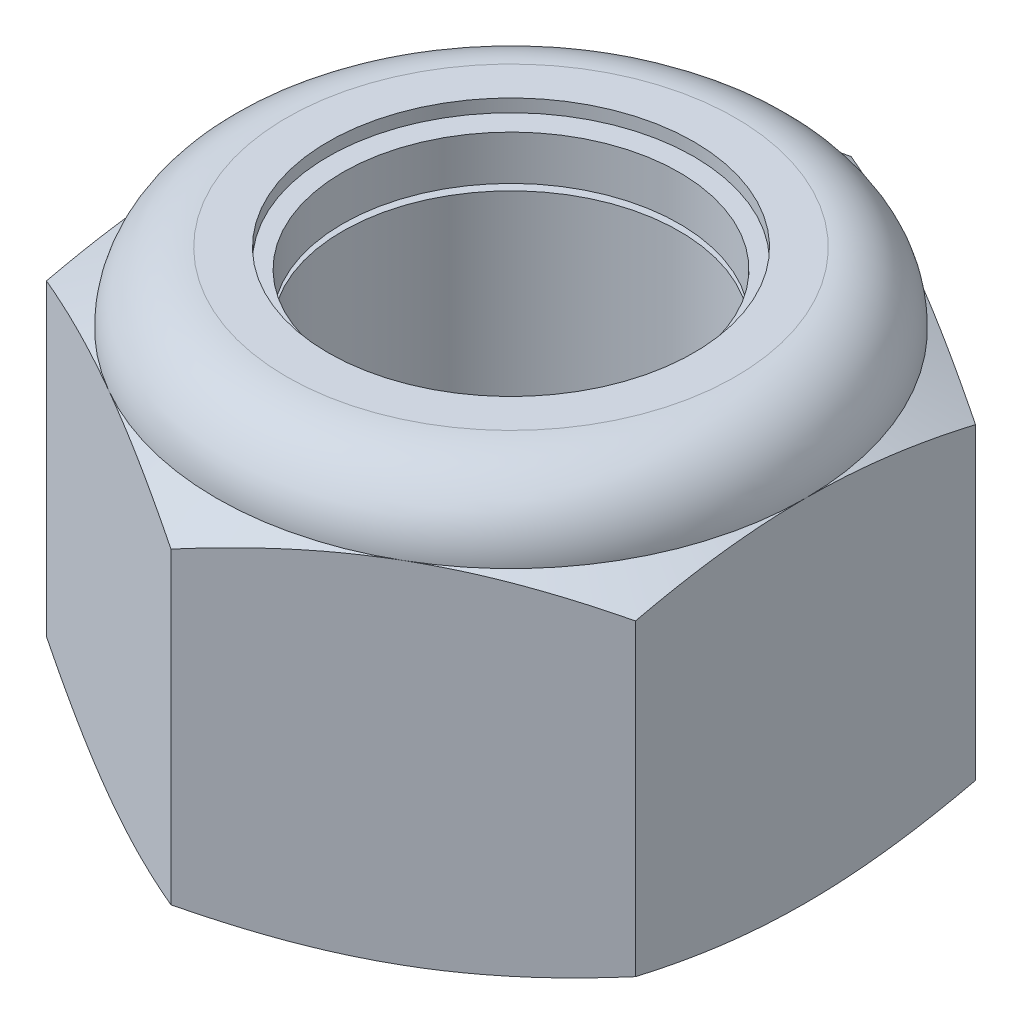
ISO-10303-21;
HEADER;
FILE_DESCRIPTION(('STEP AP214'),'2;1');
FILE_NAME('part.step','',(''),(''),'','','');
FILE_SCHEMA(('AUTOMOTIVE_DESIGN { 1 0 10303 214 1 1 1 1 }'));
ENDSEC;
DATA;
#1=APPLICATION_CONTEXT('core data for automotive mechanical design processes');
#2=APPLICATION_PROTOCOL_DEFINITION('international standard','automotive_design',2000,#1);
#3=PRODUCT_CONTEXT('',#1,'mechanical');
#4=PRODUCT('Part','Part','',(#3));
#5=PRODUCT_RELATED_PRODUCT_CATEGORY('part','',(#4));
#6=PRODUCT_DEFINITION_FORMATION('','',#4);
#7=PRODUCT_DEFINITION_CONTEXT('part definition',#1,'design');
#8=PRODUCT_DEFINITION('design','',#6,#7);
#9=PRODUCT_DEFINITION_SHAPE('','',#8);
#10=(LENGTH_UNIT() NAMED_UNIT(*) SI_UNIT(.MILLI.,.METRE.));
#11=(NAMED_UNIT(*) PLANE_ANGLE_UNIT() SI_UNIT($,.RADIAN.));
#12=(NAMED_UNIT(*) SI_UNIT($,.STERADIAN.) SOLID_ANGLE_UNIT());
#13=UNCERTAINTY_MEASURE_WITH_UNIT(LENGTH_MEASURE(1.E-05),#10,'distance_accuracy_value','');
#14=(GEOMETRIC_REPRESENTATION_CONTEXT(3) GLOBAL_UNCERTAINTY_ASSIGNED_CONTEXT((#13)) GLOBAL_UNIT_ASSIGNED_CONTEXT((#10,
#11,#12)) REPRESENTATION_CONTEXT('',''));
#15=CARTESIAN_POINT('',(0.,0.,0.));
#16=DIRECTION('',(0.,0.,1.));
#17=DIRECTION('',(1.,0.,0.));
#18=AXIS2_PLACEMENT_3D('',#15,#16,#17);
#19=CARTESIAN_POINT('',(0.,4.8476,-2.66666666666667));
#20=DIRECTION('',(0.,1.,0.));
#21=DIRECTION('',(0.,0.,-1.));
#22=AXIS2_PLACEMENT_3D('',#19,#20,#21);
#23=PLANE('',#22);
#24=CARTESIAN_POINT('',(0.,4.8476,0.));
#25=DIRECTION('',(0.,-1.,0.));
#26=DIRECTION('',(0.,0.,-1.));
#27=AXIS2_PLACEMENT_3D('',#24,#25,#26);
#28=CIRCLE('',#27,2.1731218886201);
#29=CARTESIAN_POINT('',(0.,4.8476,2.1731218886201));
#30=VERTEX_POINT('',#29);
#31=EDGE_CURVE('P0_E267',#30,#30,#28,.T.);
#32=ORIENTED_EDGE('',*,*,#31,.F.);
#33=EDGE_LOOP('',(#32));
#34=FACE_BOUND('',#33,.T.);
#35=CARTESIAN_POINT('',(0.,4.8476,0.));
#36=DIRECTION('',(0.,-1.,0.));
#37=DIRECTION('',(0.,0.,-1.));
#38=AXIS2_PLACEMENT_3D('',#35,#36,#37);
#39=CIRCLE('',#38,2.66666666666667);
#40=CARTESIAN_POINT('',(0.,4.8476,2.66666666666667));
#41=VERTEX_POINT('',#40);
#42=EDGE_CURVE('P0_E272',#41,#41,#39,.T.);
#43=ORIENTED_EDGE('',*,*,#42,.T.);
#44=EDGE_LOOP('',(#43));
#45=FACE_BOUND('',#44,.T.);
#46=ADVANCED_FACE('P0_F16',(#34,#45),#23,.F.);
#47=CARTESIAN_POINT('',(3.5,5.,-2.02072594216369));
#48=DIRECTION('',(-0.5,0.,0.866025403784439));
#49=DIRECTION('',(0.,1.,0.));
#50=AXIS2_PLACEMENT_3D('',#47,#48,#49);
#51=PLANE('',#50);
#52=DIRECTION('',(0.,-1.,0.));
#53=VECTOR('',#52,1.);
#54=CARTESIAN_POINT('',(0.,5.,-4.04145188432738));
#55=LINE('',#54,#53);
#56=CARTESIAN_POINT('',(0.,3.91418350648235,-4.04145188432738));
#57=VERTEX_POINT('',#56);
#58=CARTESIAN_POINT('',(0.,0.252483160184314,-4.04145188432738));
#59=VERTEX_POINT('',#58);
#60=EDGE_CURVE('P0_E11',#57,#59,#55,.T.);
#61=ORIENTED_EDGE('',*,*,#60,.F.);
#62=CARTESIAN_POINT('',(-1.59496526558943E-11,3.91418350647806,-4.04145188433659));
#63=CARTESIAN_POINT('',(0.93782217350252,4.16666666666667,-3.50000000000371));
#64=CARTESIAN_POINT('',(1.75,4.16666666666667,-3.03108891324554));
#65=(BOUNDED_CURVE() B_SPLINE_CURVE(2,(#62,#63,#64),.UNSPECIFIED.,.F.,
.F.) B_SPLINE_CURVE_WITH_KNOTS((3,3),(0.990996827703185,1.50671648657164),
.UNSPECIFIED.) CURVE() GEOMETRIC_REPRESENTATION_ITEM() RATIONAL_B_SPLINE_CURVE((2.39741003455638,
2.58285034609038,2.58285034609038)) REPRESENTATION_ITEM(''));
#66=CARTESIAN_POINT('',(1.75,4.16666666666667,-3.03108891324554));
#67=VERTEX_POINT('',#66);
#68=EDGE_CURVE('P0_E229',#57,#67,#65,.T.);
#69=ORIENTED_EDGE('',*,*,#68,.T.);
#70=CARTESIAN_POINT('',(1.75,4.16666666666667,-3.03108891324554));
#71=CARTESIAN_POINT('',(2.56217782649748,4.16666666666667,-2.56217782648737));
#72=CARTESIAN_POINT('',(3.50000000001595,3.91418350647806,-2.02072594215449));
#73=(BOUNDED_CURVE() B_SPLINE_CURVE(2,(#70,#71,#72),.UNSPECIFIED.,.F.,
.F.) B_SPLINE_CURVE_WITH_KNOTS((3,3),(1.50671648657164,2.02243614544009),
.UNSPECIFIED.) CURVE() GEOMETRIC_REPRESENTATION_ITEM() RATIONAL_B_SPLINE_CURVE((2.58285034609038,
2.58285034609038,2.39741003455639)) REPRESENTATION_ITEM(''));
#74=CARTESIAN_POINT('',(3.5,3.91418350648235,-2.0207259421637));
#75=VERTEX_POINT('',#74);
#76=EDGE_CURVE('P0_E203',#67,#75,#73,.T.);
#77=ORIENTED_EDGE('',*,*,#76,.T.);
#78=DIRECTION('',(0.,-1.,0.));
#79=VECTOR('',#78,1.);
#80=CARTESIAN_POINT('',(3.5,5.,-2.02072594216369));
#81=LINE('',#80,#79);
#82=CARTESIAN_POINT('',(3.5,0.252483160184312,-2.02072594216369));
#83=VERTEX_POINT('',#82);
#84=EDGE_CURVE('P0_E301',#75,#83,#81,.T.);
#85=ORIENTED_EDGE('',*,*,#84,.T.);
#86=CARTESIAN_POINT('',(3.50000000001594,0.252483160188606,-2.02072594215449));
#87=CARTESIAN_POINT('',(2.56217782649748,0.,-2.56217782648738));
#88=CARTESIAN_POINT('',(1.75,0.,-3.03108891324554));
#89=(BOUNDED_CURVE() B_SPLINE_CURVE(2,(#86,#87,#88),.UNSPECIFIED.,.F.,
.F.) B_SPLINE_CURVE_WITH_KNOTS((3,3),(0.990996827703187,1.50671648657164),
.UNSPECIFIED.) CURVE() GEOMETRIC_REPRESENTATION_ITEM() RATIONAL_B_SPLINE_CURVE((2.39741003455638,
2.58285034609038,2.58285034609038)) REPRESENTATION_ITEM(''));
#90=CARTESIAN_POINT('',(1.75,0.,-3.03108891324554));
#91=VERTEX_POINT('',#90);
#92=EDGE_CURVE('P0_E357',#83,#91,#89,.T.);
#93=ORIENTED_EDGE('',*,*,#92,.T.);
#94=CARTESIAN_POINT('',(1.75,0.,-3.03108891324554));
#95=CARTESIAN_POINT('',(0.93782217350252,0.,-3.50000000000371));
#96=CARTESIAN_POINT('',(-1.59494674188245E-11,0.252483160188609,-4.04145188433659));
#97=(BOUNDED_CURVE() B_SPLINE_CURVE(2,(#94,#95,#96),.UNSPECIFIED.,.F.,
.F.) B_SPLINE_CURVE_WITH_KNOTS((3,3),(1.50671648657164,2.02243614544009),
.UNSPECIFIED.) CURVE() GEOMETRIC_REPRESENTATION_ITEM() RATIONAL_B_SPLINE_CURVE((2.58285034609038,
2.58285034609038,2.39741003455638)) REPRESENTATION_ITEM(''));
#98=EDGE_CURVE('P0_E354',#91,#59,#97,.T.);
#99=ORIENTED_EDGE('',*,*,#98,.T.);
#100=EDGE_LOOP('',(#61,#69,#77,#85,#93,#99));
#101=FACE_BOUND('',#100,.T.);
#102=ADVANCED_FACE('P0_F517',(#101),#51,.F.);
#103=CARTESIAN_POINT('',(0.,5.,-4.04145188432738));
#104=DIRECTION('',(0.5,0.,0.866025403784439));
#105=DIRECTION('',(0.,-1.,0.));
#106=AXIS2_PLACEMENT_3D('',#103,#104,#105);
#107=PLANE('',#106);
#108=DIRECTION('',(0.,-1.,0.));
#109=VECTOR('',#108,1.);
#110=CARTESIAN_POINT('',(-3.5,5.,-2.02072594216369));
#111=LINE('',#110,#109);
#112=CARTESIAN_POINT('',(-3.5,3.91418350648235,-2.02072594216369));
#113=VERTEX_POINT('',#112);
#114=CARTESIAN_POINT('',(-3.5,0.252483160184314,-2.02072594216369));
#115=VERTEX_POINT('',#114);
#116=EDGE_CURVE('P0_E30',#113,#115,#111,.T.);
#117=ORIENTED_EDGE('',*,*,#116,.F.);
#118=CARTESIAN_POINT('',(-3.50000000001595,3.91418350647806,-2.02072594215449));
#119=CARTESIAN_POINT('',(-2.56217782649748,4.16666666666667,-2.56217782648738));
#120=CARTESIAN_POINT('',(-1.74999999999999,4.16666666666666,-3.03108891324555));
#121=(BOUNDED_CURVE() B_SPLINE_CURVE(2,(#118,#119,#120),.UNSPECIFIED.,.F.,
.F.) B_SPLINE_CURVE_WITH_KNOTS((3,3),(0.990996827703186,1.50671648657164),
.UNSPECIFIED.) CURVE() GEOMETRIC_REPRESENTATION_ITEM() RATIONAL_B_SPLINE_CURVE((2.39741003455638,
2.58285034609038,2.58285034609038)) REPRESENTATION_ITEM(''));
#122=CARTESIAN_POINT('',(-1.75,4.16666666666667,-3.03108891324554));
#123=VERTEX_POINT('',#122);
#124=EDGE_CURVE('P0_E326',#113,#123,#121,.T.);
#125=ORIENTED_EDGE('',*,*,#124,.T.);
#126=CARTESIAN_POINT('',(-1.74999999999999,4.16666666666666,-3.03108891324555));
#127=CARTESIAN_POINT('',(-0.937822173502512,4.16666666666666,-3.50000000000371));
#128=CARTESIAN_POINT('',(1.59544688197084E-11,3.91418350647806,-4.0414518843366));
#129=(BOUNDED_CURVE() B_SPLINE_CURVE(2,(#126,#127,#128),.UNSPECIFIED.,.F.,
.F.) B_SPLINE_CURVE_WITH_KNOTS((3,3),(1.50671648657164,2.02243614544009),
.UNSPECIFIED.) CURVE() GEOMETRIC_REPRESENTATION_ITEM() RATIONAL_B_SPLINE_CURVE((2.58285034609038,
2.58285034609038,2.39741003455638)) REPRESENTATION_ITEM(''));
#130=EDGE_CURVE('P0_E243',#123,#57,#129,.T.);
#131=ORIENTED_EDGE('',*,*,#130,.T.);
#132=ORIENTED_EDGE('',*,*,#60,.T.);
#133=CARTESIAN_POINT('',(1.59476150481268E-11,0.252483160188607,-4.04145188433659));
#134=CARTESIAN_POINT('',(-0.937822173502524,0.,-3.5000000000037));
#135=CARTESIAN_POINT('',(-1.75000000000001,0.,-3.03108891324554));
#136=(BOUNDED_CURVE() B_SPLINE_CURVE(2,(#133,#134,#135),.UNSPECIFIED.,.F.,
.F.) B_SPLINE_CURVE_WITH_KNOTS((3,3),(0.990996827703185,1.50671648657164),
.UNSPECIFIED.) CURVE() GEOMETRIC_REPRESENTATION_ITEM() RATIONAL_B_SPLINE_CURVE((2.39741003455638,
2.58285034609038,2.58285034609038)) REPRESENTATION_ITEM(''));
#137=CARTESIAN_POINT('',(-1.75,0.,-3.03108891324554));
#138=VERTEX_POINT('',#137);
#139=EDGE_CURVE('P0_E347',#59,#138,#136,.T.);
#140=ORIENTED_EDGE('',*,*,#139,.T.);
#141=CARTESIAN_POINT('',(-1.75000000000001,0.,-3.03108891324554));
#142=CARTESIAN_POINT('',(-2.56217782649749,0.,-2.56217782648737));
#143=CARTESIAN_POINT('',(-3.50000000001596,0.25248316018861,-2.02072594215448));
#144=(BOUNDED_CURVE() B_SPLINE_CURVE(2,(#141,#142,#143),.UNSPECIFIED.,.F.,
.F.) B_SPLINE_CURVE_WITH_KNOTS((3,3),(1.50671648657164,2.02243614544009),
.UNSPECIFIED.) CURVE() GEOMETRIC_REPRESENTATION_ITEM() RATIONAL_B_SPLINE_CURVE((2.58285034609038,
2.58285034609038,2.39741003455638)) REPRESENTATION_ITEM(''));
#145=EDGE_CURVE('P0_E258',#138,#115,#144,.T.);
#146=ORIENTED_EDGE('',*,*,#145,.T.);
#147=EDGE_LOOP('',(#117,#125,#131,#132,#140,#146));
#148=FACE_BOUND('',#147,.T.);
#149=ADVANCED_FACE('P0_F554',(#148),#107,.F.);
#150=CARTESIAN_POINT('',(-3.5,5.,-2.02072594216369));
#151=DIRECTION('',(1.,0.,0.));
#152=DIRECTION('',(0.,1.,0.));
#153=AXIS2_PLACEMENT_3D('',#150,#151,#152);
#154=PLANE('',#153);
#155=DIRECTION('',(0.,-1.,0.));
#156=VECTOR('',#155,1.);
#157=CARTESIAN_POINT('',(-3.5,5.,2.02072594216369));
#158=LINE('',#157,#156);
#159=CARTESIAN_POINT('',(-3.5,3.91418350648235,2.02072594216368));
#160=VERTEX_POINT('',#159);
#161=CARTESIAN_POINT('',(-3.5,0.252483160184314,2.02072594216368));
#162=VERTEX_POINT('',#161);
#163=EDGE_CURVE('P0_E300',#160,#162,#158,.T.);
#164=ORIENTED_EDGE('',*,*,#163,.F.);
#165=CARTESIAN_POINT('',(-3.5,3.91418350647806,2.0207259421821));
#166=CARTESIAN_POINT('',(-3.5,4.16666666666667,0.937822173516332));
#167=CARTESIAN_POINT('',(-3.5,4.16666666666667,0.));
#168=(BOUNDED_CURVE() B_SPLINE_CURVE(2,(#165,#166,#167),.UNSPECIFIED.,.F.,
.F.) B_SPLINE_CURVE_WITH_KNOTS((3,3),(0.990996827703187,1.50671648657164),
.UNSPECIFIED.) CURVE() GEOMETRIC_REPRESENTATION_ITEM() RATIONAL_B_SPLINE_CURVE((2.39741003455639,
2.58285034609038,2.58285034609038)) REPRESENTATION_ITEM(''));
#169=CARTESIAN_POINT('',(-3.5,4.16666666666667,0.));
#170=VERTEX_POINT('',#169);
#171=EDGE_CURVE('P0_E331',#160,#170,#168,.T.);
#172=ORIENTED_EDGE('',*,*,#171,.T.);
#173=CARTESIAN_POINT('',(-3.5,4.16666666666667,0.));
#174=CARTESIAN_POINT('',(-3.5,4.16666666666667,-0.93782217351633));
#175=CARTESIAN_POINT('',(-3.5,3.91418350647806,-2.02072594218211));
#176=(BOUNDED_CURVE() B_SPLINE_CURVE(2,(#173,#174,#175),.UNSPECIFIED.,.F.,
.F.) B_SPLINE_CURVE_WITH_KNOTS((3,3),(1.50671648657164,2.02243614544009),
.UNSPECIFIED.) CURVE() GEOMETRIC_REPRESENTATION_ITEM() RATIONAL_B_SPLINE_CURVE((2.58285034609038,
2.58285034609038,2.39741003455638)) REPRESENTATION_ITEM(''));
#177=EDGE_CURVE('P0_E190',#170,#113,#176,.T.);
#178=ORIENTED_EDGE('',*,*,#177,.T.);
#179=ORIENTED_EDGE('',*,*,#116,.T.);
#180=CARTESIAN_POINT('',(-3.5,0.252483160188608,-2.02072594218211));
#181=CARTESIAN_POINT('',(-3.5,0.,-0.937822173516336));
#182=CARTESIAN_POINT('',(-3.5,0.,0.));
#183=(BOUNDED_CURVE() B_SPLINE_CURVE(2,(#180,#181,#182),.UNSPECIFIED.,.F.,
.F.) B_SPLINE_CURVE_WITH_KNOTS((3,3),(0.990996827703184,1.50671648657163),
.UNSPECIFIED.) CURVE() GEOMETRIC_REPRESENTATION_ITEM() RATIONAL_B_SPLINE_CURVE((2.39741003455638,
2.58285034609038,2.58285034609038)) REPRESENTATION_ITEM(''));
#184=CARTESIAN_POINT('',(-3.5,0.,0.));
#185=VERTEX_POINT('',#184);
#186=EDGE_CURVE('P0_E164',#115,#185,#183,.T.);
#187=ORIENTED_EDGE('',*,*,#186,.T.);
#188=CARTESIAN_POINT('',(-3.5,0.,0.));
#189=CARTESIAN_POINT('',(-3.5,0.,0.937822173516328));
#190=CARTESIAN_POINT('',(-3.5,0.252483160188605,2.0207259421821));
#191=(BOUNDED_CURVE() B_SPLINE_CURVE(2,(#188,#189,#190),.UNSPECIFIED.,.F.,
.F.) B_SPLINE_CURVE_WITH_KNOTS((3,3),(1.50671648657163,2.02243614544008),
.UNSPECIFIED.) CURVE() GEOMETRIC_REPRESENTATION_ITEM() RATIONAL_B_SPLINE_CURVE((2.58285034609038,
2.58285034609038,2.39741003455638)) REPRESENTATION_ITEM(''));
#192=EDGE_CURVE('P0_E205',#185,#162,#191,.T.);
#193=ORIENTED_EDGE('',*,*,#192,.T.);
#194=EDGE_LOOP('',(#164,#172,#178,#179,#187,#193));
#195=FACE_BOUND('',#194,.T.);
#196=ADVANCED_FACE('P0_F483',(#195),#154,.F.);
#197=CARTESIAN_POINT('',(-3.5,5.,2.02072594216369));
#198=DIRECTION('',(0.5,0.,-0.866025403784439));
#199=DIRECTION('',(0.,-1.,0.));
#200=AXIS2_PLACEMENT_3D('',#197,#198,#199);
#201=PLANE('',#200);
#202=DIRECTION('',(0.,-1.,0.));
#203=VECTOR('',#202,1.);
#204=CARTESIAN_POINT('',(0.,5.,4.04145188432738));
#205=LINE('',#204,#203);
#206=CARTESIAN_POINT('',(0.,3.91418350648235,4.04145188432738));
#207=VERTEX_POINT('',#206);
#208=CARTESIAN_POINT('',(0.,0.252483160184314,4.04145188432738));
#209=VERTEX_POINT('',#208);
#210=EDGE_CURVE('P0_E295',#207,#209,#205,.T.);
#211=ORIENTED_EDGE('',*,*,#210,.F.);
#212=CARTESIAN_POINT('',(1.59398350911962E-11,3.91418350647806,4.04145188433658));
#213=CARTESIAN_POINT('',(-0.937822173502524,4.16666666666667,3.5000000000037));
#214=CARTESIAN_POINT('',(-1.75,4.16666666666667,3.03108891324553));
#215=(BOUNDED_CURVE() B_SPLINE_CURVE(2,(#212,#213,#214),.UNSPECIFIED.,.F.,
.F.) B_SPLINE_CURVE_WITH_KNOTS((3,3),(0.990996827703187,1.50671648657164),
.UNSPECIFIED.) CURVE() GEOMETRIC_REPRESENTATION_ITEM() RATIONAL_B_SPLINE_CURVE((2.39741003455639,
2.58285034609039,2.58285034609039)) REPRESENTATION_ITEM(''));
#216=CARTESIAN_POINT('',(-1.75,4.16666666666667,3.03108891324553));
#217=VERTEX_POINT('',#216);
#218=EDGE_CURVE('P0_E186',#207,#217,#215,.T.);
#219=ORIENTED_EDGE('',*,*,#218,.T.);
#220=CARTESIAN_POINT('',(-1.75,4.16666666666667,3.03108891324553));
#221=CARTESIAN_POINT('',(-2.56217782649749,4.16666666666667,2.56217782648736));
#222=CARTESIAN_POINT('',(-3.50000000001597,3.91418350647806,2.02072594215447));
#223=(BOUNDED_CURVE() B_SPLINE_CURVE(2,(#220,#221,#222),.UNSPECIFIED.,.F.,
.F.) B_SPLINE_CURVE_WITH_KNOTS((3,3),(1.50671648657164,2.02243614544009),
.UNSPECIFIED.) CURVE() GEOMETRIC_REPRESENTATION_ITEM() RATIONAL_B_SPLINE_CURVE((2.58285034609039,
2.58285034609039,2.39741003455638)) REPRESENTATION_ITEM(''));
#224=EDGE_CURVE('P0_E209',#217,#160,#223,.T.);
#225=ORIENTED_EDGE('',*,*,#224,.T.);
#226=ORIENTED_EDGE('',*,*,#163,.T.);
#227=CARTESIAN_POINT('',(-3.50000000001595,0.252483160188607,2.02072594215448));
#228=CARTESIAN_POINT('',(-2.56217782649748,0.,2.56217782648737));
#229=CARTESIAN_POINT('',(-1.75,0.,3.03108891324554));
#230=(BOUNDED_CURVE() B_SPLINE_CURVE(2,(#227,#228,#229),.UNSPECIFIED.,.F.,
.F.) B_SPLINE_CURVE_WITH_KNOTS((3,3),(0.990996827703184,1.50671648657164),
.UNSPECIFIED.) CURVE() GEOMETRIC_REPRESENTATION_ITEM() RATIONAL_B_SPLINE_CURVE((2.39741003455638,
2.58285034609038,2.58285034609038)) REPRESENTATION_ITEM(''));
#231=CARTESIAN_POINT('',(-1.75,0.,3.03108891324554));
#232=VERTEX_POINT('',#231);
#233=EDGE_CURVE('P0_E211',#162,#232,#230,.T.);
#234=ORIENTED_EDGE('',*,*,#233,.T.);
#235=CARTESIAN_POINT('',(-1.75,0.,3.03108891324554));
#236=CARTESIAN_POINT('',(-0.93782217350252,0.,3.5000000000037));
#237=CARTESIAN_POINT('',(1.59478002851965E-11,0.252483160188605,4.04145188433659));
#238=(BOUNDED_CURVE() B_SPLINE_CURVE(2,(#235,#236,#237),.UNSPECIFIED.,.F.,
.F.) B_SPLINE_CURVE_WITH_KNOTS((3,3),(1.50671648657164,2.02243614544009),
.UNSPECIFIED.) CURVE() GEOMETRIC_REPRESENTATION_ITEM() RATIONAL_B_SPLINE_CURVE((2.58285034609038,
2.58285034609038,2.39741003455638)) REPRESENTATION_ITEM(''));
#239=EDGE_CURVE('P0_E151',#232,#209,#238,.T.);
#240=ORIENTED_EDGE('',*,*,#239,.T.);
#241=EDGE_LOOP('',(#211,#219,#225,#226,#234,#240));
#242=FACE_BOUND('',#241,.T.);
#243=ADVANCED_FACE('P0_F496',(#242),#201,.F.);
#244=CARTESIAN_POINT('',(0.,5.,4.04145188432738));
#245=DIRECTION('',(-0.5,0.,-0.866025403784439));
#246=DIRECTION('',(-0.866025403784439,0.,0.5));
#247=AXIS2_PLACEMENT_3D('',#244,#245,#246);
#248=PLANE('',#247);
#249=DIRECTION('',(0.,-1.,0.));
#250=VECTOR('',#249,1.);
#251=CARTESIAN_POINT('',(3.5,5.,2.02072594216369));
#252=LINE('',#251,#250);
#253=CARTESIAN_POINT('',(3.5,3.91418350648235,2.02072594216369));
#254=VERTEX_POINT('',#253);
#255=CARTESIAN_POINT('',(3.5,0.252483160184314,2.0207259421637));
#256=VERTEX_POINT('',#255);
#257=EDGE_CURVE('P0_E41',#254,#256,#252,.T.);
#258=ORIENTED_EDGE('',*,*,#257,.F.);
#259=CARTESIAN_POINT('',(3.50000000001595,3.91418350647806,2.02072594215448));
#260=CARTESIAN_POINT('',(2.56217782649748,4.16666666666667,2.56217782648737));
#261=CARTESIAN_POINT('',(1.75,4.16666666666667,3.03108891324553));
#262=(BOUNDED_CURVE() B_SPLINE_CURVE(2,(#259,#260,#261),.UNSPECIFIED.,.F.,
.F.) B_SPLINE_CURVE_WITH_KNOTS((3,3),(0.990996827703186,1.50671648657164),
.UNSPECIFIED.) CURVE() GEOMETRIC_REPRESENTATION_ITEM() RATIONAL_B_SPLINE_CURVE((2.39741003455638,
2.58285034609038,2.58285034609038)) REPRESENTATION_ITEM(''));
#263=CARTESIAN_POINT('',(1.75,4.16666666666667,3.03108891324554));
#264=VERTEX_POINT('',#263);
#265=EDGE_CURVE('P0_E315',#254,#264,#262,.T.);
#266=ORIENTED_EDGE('',*,*,#265,.T.);
#267=CARTESIAN_POINT('',(1.75,4.16666666666667,3.03108891324553));
#268=CARTESIAN_POINT('',(0.93782217350252,4.16666666666667,3.5000000000037));
#269=CARTESIAN_POINT('',(-1.59465036257081E-11,3.91418350647806,4.04145188433658));
#270=(BOUNDED_CURVE() B_SPLINE_CURVE(2,(#267,#268,#269),.UNSPECIFIED.,.F.,
.F.) B_SPLINE_CURVE_WITH_KNOTS((3,3),(1.50671648657164,2.02243614544009),
.UNSPECIFIED.) CURVE() GEOMETRIC_REPRESENTATION_ITEM() RATIONAL_B_SPLINE_CURVE((2.58285034609038,
2.58285034609038,2.39741003455639)) REPRESENTATION_ITEM(''));
#271=EDGE_CURVE('P0_E179',#264,#207,#270,.T.);
#272=ORIENTED_EDGE('',*,*,#271,.T.);
#273=ORIENTED_EDGE('',*,*,#210,.T.);
#274=CARTESIAN_POINT('',(-1.59579883240341E-11,0.252483160188609,4.04145188433659));
#275=CARTESIAN_POINT('',(0.937822173502516,0.,3.5000000000037));
#276=CARTESIAN_POINT('',(1.75,0.,3.03108891324554));
#277=(BOUNDED_CURVE() B_SPLINE_CURVE(2,(#274,#275,#276),.UNSPECIFIED.,.F.,
.F.) B_SPLINE_CURVE_WITH_KNOTS((3,3),(0.990996827703183,1.50671648657164),
.UNSPECIFIED.) CURVE() GEOMETRIC_REPRESENTATION_ITEM() RATIONAL_B_SPLINE_CURVE((2.39741003455638,
2.58285034609038,2.58285034609038)) REPRESENTATION_ITEM(''));
#278=CARTESIAN_POINT('',(1.75,0.,3.03108891324554));
#279=VERTEX_POINT('',#278);
#280=EDGE_CURVE('P0_E161',#209,#279,#277,.T.);
#281=ORIENTED_EDGE('',*,*,#280,.T.);
#282=CARTESIAN_POINT('',(1.75,0.,3.03108891324554));
#283=CARTESIAN_POINT('',(2.56217782649748,0.,2.56217782648737));
#284=CARTESIAN_POINT('',(3.50000000001595,0.252483160188606,2.02072594215448));
#285=(BOUNDED_CURVE() B_SPLINE_CURVE(2,(#282,#283,#284),.UNSPECIFIED.,.F.,
.F.) B_SPLINE_CURVE_WITH_KNOTS((3,3),(1.50671648657164,2.02243614544009),
.UNSPECIFIED.) CURVE() GEOMETRIC_REPRESENTATION_ITEM() RATIONAL_B_SPLINE_CURVE((2.58285034609038,
2.58285034609038,2.39741003455638)) REPRESENTATION_ITEM(''));
#286=EDGE_CURVE('P0_E317',#279,#256,#285,.T.);
#287=ORIENTED_EDGE('',*,*,#286,.T.);
#288=EDGE_LOOP('',(#258,#266,#272,#273,#281,#287));
#289=FACE_BOUND('',#288,.T.);
#290=ADVANCED_FACE('P0_F523',(#289),#248,.F.);
#291=CARTESIAN_POINT('',(3.5,5.,2.02072594216369));
#292=DIRECTION('',(-1.,0.,0.));
#293=DIRECTION('',(0.,0.,1.));
#294=AXIS2_PLACEMENT_3D('',#291,#292,#293);
#295=PLANE('',#294);
#296=ORIENTED_EDGE('',*,*,#84,.F.);
#297=CARTESIAN_POINT('',(3.5,3.91418350647806,-2.02072594218212));
#298=CARTESIAN_POINT('',(3.5,4.16666666666667,-0.937822173516332));
#299=CARTESIAN_POINT('',(3.5,4.16666666666667,0.));
#300=(BOUNDED_CURVE() B_SPLINE_CURVE(2,(#297,#298,#299),.UNSPECIFIED.,.F.,
.F.) B_SPLINE_CURVE_WITH_KNOTS((3,3),(0.990996827703183,1.50671648657164),
.UNSPECIFIED.) CURVE() GEOMETRIC_REPRESENTATION_ITEM() RATIONAL_B_SPLINE_CURVE((2.39741003455638,
2.58285034609039,2.58285034609039)) REPRESENTATION_ITEM(''));
#301=CARTESIAN_POINT('',(3.5,4.16666666666667,0.));
#302=VERTEX_POINT('',#301);
#303=EDGE_CURVE('P0_E193',#75,#302,#300,.T.);
#304=ORIENTED_EDGE('',*,*,#303,.T.);
#305=CARTESIAN_POINT('',(3.5,4.16666666666667,0.));
#306=CARTESIAN_POINT('',(3.5,4.16666666666667,0.93782217351634));
#307=CARTESIAN_POINT('',(3.5,3.91418350647806,2.02072594218211));
#308=(BOUNDED_CURVE() B_SPLINE_CURVE(2,(#305,#306,#307),.UNSPECIFIED.,.F.,
.F.) B_SPLINE_CURVE_WITH_KNOTS((3,3),(1.50671648657164,2.02243614544009),
.UNSPECIFIED.) CURVE() GEOMETRIC_REPRESENTATION_ITEM() RATIONAL_B_SPLINE_CURVE((2.58285034609039,
2.58285034609038,2.39741003455639)) REPRESENTATION_ITEM(''));
#309=EDGE_CURVE('P0_E393',#302,#254,#308,.T.);
#310=ORIENTED_EDGE('',*,*,#309,.T.);
#311=ORIENTED_EDGE('',*,*,#257,.T.);
#312=CARTESIAN_POINT('',(3.5,0.252483160188607,2.02072594218212));
#313=CARTESIAN_POINT('',(3.5,0.,0.937822173516338));
#314=CARTESIAN_POINT('',(3.5,0.,0.));
#315=(BOUNDED_CURVE() B_SPLINE_CURVE(2,(#312,#313,#314),.UNSPECIFIED.,.F.,
.F.) B_SPLINE_CURVE_WITH_KNOTS((3,3),(0.990996827703182,1.50671648657163),
.UNSPECIFIED.) CURVE() GEOMETRIC_REPRESENTATION_ITEM() RATIONAL_B_SPLINE_CURVE((2.39741003455639,
2.58285034609039,2.58285034609039)) REPRESENTATION_ITEM(''));
#316=CARTESIAN_POINT('',(3.5,0.,0.));
#317=VERTEX_POINT('',#316);
#318=EDGE_CURVE('P0_E324',#256,#317,#315,.T.);
#319=ORIENTED_EDGE('',*,*,#318,.T.);
#320=CARTESIAN_POINT('',(3.5,0.,0.));
#321=CARTESIAN_POINT('',(3.5,0.,-0.937822173516332));
#322=CARTESIAN_POINT('',(3.5,0.252483160188605,-2.02072594218211));
#323=(BOUNDED_CURVE() B_SPLINE_CURVE(2,(#320,#321,#322),.UNSPECIFIED.,.F.,
.F.) B_SPLINE_CURVE_WITH_KNOTS((3,3),(1.50671648657163,2.02243614544009),
.UNSPECIFIED.) CURVE() GEOMETRIC_REPRESENTATION_ITEM() RATIONAL_B_SPLINE_CURVE((2.58285034609039,
2.58285034609039,2.39741003455639)) REPRESENTATION_ITEM(''));
#324=EDGE_CURVE('P0_E322',#317,#83,#323,.T.);
#325=ORIENTED_EDGE('',*,*,#324,.T.);
#326=EDGE_LOOP('',(#296,#304,#310,#311,#319,#325));
#327=FACE_BOUND('',#326,.T.);
#328=ADVANCED_FACE('P0_F527',(#327),#295,.F.);
#329=CARTESIAN_POINT('',(0.,4.16666666666667,0.));
#330=DIRECTION('',(0.,-1.,0.));
#331=DIRECTION('',(0.,0.,-1.));
#332=AXIS2_PLACEMENT_3D('',#329,#330,#331);
#333=CONICAL_SURFACE('',#332,3.5,1.13446401379631);
#334=ORIENTED_EDGE('',*,*,#309,.F.);
#335=CARTESIAN_POINT('',(0.,4.16666666666667,0.));
#336=DIRECTION('',(0.,-1.,0.));
#337=DIRECTION('',(0.,0.,-1.));
#338=AXIS2_PLACEMENT_3D('',#335,#336,#337);
#339=CIRCLE('',#338,3.5);
#340=EDGE_CURVE('P0_E215',#302,#264,#339,.T.);
#341=ORIENTED_EDGE('',*,*,#340,.T.);
#342=ORIENTED_EDGE('',*,*,#265,.F.);
#343=EDGE_LOOP('',(#334,#341,#342));
#344=FACE_BOUND('',#343,.T.);
#345=ADVANCED_FACE('P0_F730',(#344),#333,.T.);
#346=CARTESIAN_POINT('',(0.,4.16666666666667,0.));
#347=DIRECTION('',(0.,-1.,0.));
#348=DIRECTION('',(0.,0.,-1.));
#349=AXIS2_PLACEMENT_3D('',#346,#347,#348);
#350=CONICAL_SURFACE('',#349,3.5,1.13446401379631);
#351=CARTESIAN_POINT('',(0.,4.16666666666667,0.));
#352=DIRECTION('',(0.,-1.,0.));
#353=DIRECTION('',(0.,0.,-1.));
#354=AXIS2_PLACEMENT_3D('',#351,#352,#353);
#355=CIRCLE('',#354,3.5);
#356=EDGE_CURVE('P0_E217',#67,#302,#355,.T.);
#357=ORIENTED_EDGE('',*,*,#356,.T.);
#358=ORIENTED_EDGE('',*,*,#303,.F.);
#359=ORIENTED_EDGE('',*,*,#76,.F.);
#360=EDGE_LOOP('',(#357,#358,#359));
#361=FACE_BOUND('',#360,.T.);
#362=ADVANCED_FACE('P0_F535',(#361),#350,.T.);
#363=CARTESIAN_POINT('',(0.,4.16666666666667,0.));
#364=DIRECTION('',(0.,-1.,0.));
#365=DIRECTION('',(0.,0.,1.));
#366=AXIS2_PLACEMENT_3D('',#363,#364,#365);
#367=CONICAL_SURFACE('',#366,3.5,1.13446401379631);
#368=ORIENTED_EDGE('',*,*,#271,.F.);
#369=CARTESIAN_POINT('',(0.,4.16666666666667,0.));
#370=DIRECTION('',(0.,-1.,0.));
#371=DIRECTION('',(0.,0.,-1.));
#372=AXIS2_PLACEMENT_3D('',#369,#370,#371);
#373=CIRCLE('',#372,3.5);
#374=CARTESIAN_POINT('',(0.,4.16666666666667,3.5));
#375=VERTEX_POINT('',#374);
#376=EDGE_CURVE('P0_E172',#264,#375,#373,.T.);
#377=ORIENTED_EDGE('',*,*,#376,.T.);
#378=CARTESIAN_POINT('',(0.,4.16666666666667,0.));
#379=DIRECTION('',(0.,-1.,0.));
#380=DIRECTION('',(0.,0.,-1.));
#381=AXIS2_PLACEMENT_3D('',#378,#379,#380);
#382=CIRCLE('',#381,3.5);
#383=EDGE_CURVE('P0_E187',#375,#217,#382,.T.);
#384=ORIENTED_EDGE('',*,*,#383,.T.);
#385=ORIENTED_EDGE('',*,*,#218,.F.);
#386=EDGE_LOOP('',(#368,#377,#384,#385));
#387=FACE_BOUND('',#386,.T.);
#388=ADVANCED_FACE('P0_F539',(#387),#367,.T.);
#389=CARTESIAN_POINT('',(0.,4.16666666666667,0.));
#390=DIRECTION('',(0.,-1.,0.));
#391=DIRECTION('',(0.,0.,-1.));
#392=AXIS2_PLACEMENT_3D('',#389,#390,#391);
#393=CONICAL_SURFACE('',#392,3.5,1.13446401379631);
#394=CARTESIAN_POINT('',(0.,4.16666666666667,0.));
#395=DIRECTION('',(0.,-1.,0.));
#396=DIRECTION('',(0.,0.,-1.));
#397=AXIS2_PLACEMENT_3D('',#394,#395,#396);
#398=CIRCLE('',#397,3.5);
#399=EDGE_CURVE('P0_E360',#170,#123,#398,.T.);
#400=ORIENTED_EDGE('',*,*,#399,.T.);
#401=ORIENTED_EDGE('',*,*,#124,.F.);
#402=ORIENTED_EDGE('',*,*,#177,.F.);
#403=EDGE_LOOP('',(#400,#401,#402));
#404=FACE_BOUND('',#403,.T.);
#405=ADVANCED_FACE('P0_F549',(#404),#393,.T.);
#406=CARTESIAN_POINT('',(0.,4.16666666666667,0.));
#407=DIRECTION('',(0.,-1.,0.));
#408=DIRECTION('',(0.,0.,-1.));
#409=AXIS2_PLACEMENT_3D('',#406,#407,#408);
#410=CONICAL_SURFACE('',#409,3.5,1.13446401379631);
#411=ORIENTED_EDGE('',*,*,#224,.F.);
#412=CARTESIAN_POINT('',(0.,4.16666666666667,0.));
#413=DIRECTION('',(0.,-1.,0.));
#414=DIRECTION('',(0.,0.,-1.));
#415=AXIS2_PLACEMENT_3D('',#412,#413,#414);
#416=CIRCLE('',#415,3.5);
#417=EDGE_CURVE('P0_E20',#217,#170,#416,.T.);
#418=ORIENTED_EDGE('',*,*,#417,.T.);
#419=ORIENTED_EDGE('',*,*,#171,.F.);
#420=EDGE_LOOP('',(#411,#418,#419));
#421=FACE_BOUND('',#420,.T.);
#422=ADVANCED_FACE('P0_F546',(#421),#410,.T.);
#423=CARTESIAN_POINT('',(0.,0.252483160184314,0.));
#424=DIRECTION('',(0.,1.,0.));
#425=DIRECTION('',(0.,0.,1.));
#426=AXIS2_PLACEMENT_3D('',#423,#424,#425);
#427=CONICAL_SURFACE('',#426,4.04145188432738,1.13446401379631);
#428=CARTESIAN_POINT('',(0.,0.,0.));
#429=DIRECTION('',(0.,-1.,0.));
#430=DIRECTION('',(0.,0.,-1.));
#431=AXIS2_PLACEMENT_3D('',#428,#429,#430);
#432=CIRCLE('',#431,3.5);
#433=EDGE_CURVE('P0_E158',#232,#185,#432,.T.);
#434=ORIENTED_EDGE('',*,*,#433,.F.);
#435=ORIENTED_EDGE('',*,*,#233,.F.);
#436=ORIENTED_EDGE('',*,*,#192,.F.);
#437=EDGE_LOOP('',(#434,#435,#436));
#438=FACE_BOUND('',#437,.T.);
#439=ADVANCED_FACE('P0_F493',(#438),#427,.T.);
#440=CARTESIAN_POINT('',(0.,0.252483160184314,0.));
#441=DIRECTION('',(0.,1.,0.));
#442=DIRECTION('',(0.,0.,1.));
#443=AXIS2_PLACEMENT_3D('',#440,#441,#442);
#444=CONICAL_SURFACE('',#443,4.04145188432738,1.13446401379631);
#445=CARTESIAN_POINT('',(0.,0.,0.));
#446=DIRECTION('',(0.,-1.,0.));
#447=DIRECTION('',(0.,0.,-1.));
#448=AXIS2_PLACEMENT_3D('',#445,#446,#447);
#449=CIRCLE('',#448,3.5);
#450=EDGE_CURVE('P0_E244',#185,#138,#449,.T.);
#451=ORIENTED_EDGE('',*,*,#450,.F.);
#452=ORIENTED_EDGE('',*,*,#186,.F.);
#453=ORIENTED_EDGE('',*,*,#145,.F.);
#454=EDGE_LOOP('',(#451,#452,#453));
#455=FACE_BOUND('',#454,.T.);
#456=ADVANCED_FACE('P0_F490',(#455),#444,.T.);
#457=CARTESIAN_POINT('',(0.,0.252483160184314,0.));
#458=DIRECTION('',(0.,1.,0.));
#459=DIRECTION('',(0.,0.,-1.));
#460=AXIS2_PLACEMENT_3D('',#457,#458,#459);
#461=CONICAL_SURFACE('',#460,4.04145188432738,1.13446401379631);
#462=CARTESIAN_POINT('',(0.,0.,0.));
#463=DIRECTION('',(0.,-1.,0.));
#464=DIRECTION('',(0.,0.,-1.));
#465=AXIS2_PLACEMENT_3D('',#462,#463,#464);
#466=CIRCLE('',#465,3.5);
#467=EDGE_CURVE('P0_E177',#138,#91,#466,.T.);
#468=ORIENTED_EDGE('',*,*,#467,.F.);
#469=ORIENTED_EDGE('',*,*,#139,.F.);
#470=ORIENTED_EDGE('',*,*,#98,.F.);
#471=EDGE_LOOP('',(#468,#469,#470));
#472=FACE_BOUND('',#471,.T.);
#473=ADVANCED_FACE('P0_F514',(#472),#461,.T.);
#474=CARTESIAN_POINT('',(0.,0.252483160184314,0.));
#475=DIRECTION('',(0.,1.,0.));
#476=DIRECTION('',(0.,0.,1.));
#477=AXIS2_PLACEMENT_3D('',#474,#475,#476);
#478=CONICAL_SURFACE('',#477,4.04145188432738,1.13446401379631);
#479=ORIENTED_EDGE('',*,*,#324,.F.);
#480=CARTESIAN_POINT('',(0.,0.,0.));
#481=DIRECTION('',(0.,-1.,0.));
#482=DIRECTION('',(0.,0.,-1.));
#483=AXIS2_PLACEMENT_3D('',#480,#481,#482);
#484=CIRCLE('',#483,3.5);
#485=EDGE_CURVE('P0_E173',#91,#317,#484,.T.);
#486=ORIENTED_EDGE('',*,*,#485,.F.);
#487=ORIENTED_EDGE('',*,*,#92,.F.);
#488=EDGE_LOOP('',(#479,#486,#487));
#489=FACE_BOUND('',#488,.T.);
#490=ADVANCED_FACE('P0_F519',(#489),#478,.T.);
#491=CARTESIAN_POINT('',(0.,0.252483160184314,0.));
#492=DIRECTION('',(0.,1.,0.));
#493=DIRECTION('',(0.,0.,1.));
#494=AXIS2_PLACEMENT_3D('',#491,#492,#493);
#495=CONICAL_SURFACE('',#494,4.04145188432738,1.13446401379631);
#496=CARTESIAN_POINT('',(0.,0.,0.));
#497=DIRECTION('',(0.,-1.,0.));
#498=DIRECTION('',(0.,0.,-1.));
#499=AXIS2_PLACEMENT_3D('',#496,#497,#498);
#500=CIRCLE('',#499,3.5);
#501=EDGE_CURVE('P0_E178',#317,#279,#500,.T.);
#502=ORIENTED_EDGE('',*,*,#501,.F.);
#503=ORIENTED_EDGE('',*,*,#318,.F.);
#504=ORIENTED_EDGE('',*,*,#286,.F.);
#505=EDGE_LOOP('',(#502,#503,#504));
#506=FACE_BOUND('',#505,.T.);
#507=ADVANCED_FACE('P0_F528',(#506),#495,.T.);
#508=CARTESIAN_POINT('',(0.,0.,-4.04145188432738));
#509=DIRECTION('',(0.,1.,0.));
#510=DIRECTION('',(1.,0.,0.));
#511=AXIS2_PLACEMENT_3D('',#508,#509,#510);
#512=PLANE('',#511);
#513=CARTESIAN_POINT('',(0.,0.,0.));
#514=DIRECTION('',(0.,-1.,0.));
#515=DIRECTION('',(0.,0.,-1.));
#516=AXIS2_PLACEMENT_3D('',#513,#514,#515);
#517=CIRCLE('',#516,2.);
#518=CARTESIAN_POINT('',(0.,0.,2.));
#519=VERTEX_POINT('',#518);
#520=EDGE_CURVE('P0_E149',#519,#519,#517,.T.);
#521=ORIENTED_EDGE('',*,*,#520,.F.);
#522=EDGE_LOOP('',(#521));
#523=FACE_BOUND('',#522,.T.);
#524=CARTESIAN_POINT('',(0.,0.,0.));
#525=DIRECTION('',(0.,-1.,0.));
#526=DIRECTION('',(0.,0.,-1.));
#527=AXIS2_PLACEMENT_3D('',#524,#525,#526);
#528=CIRCLE('',#527,3.5);
#529=EDGE_CURVE('P0_E252',#279,#232,#528,.T.);
#530=ORIENTED_EDGE('',*,*,#529,.T.);
#531=ORIENTED_EDGE('',*,*,#433,.T.);
#532=ORIENTED_EDGE('',*,*,#450,.T.);
#533=ORIENTED_EDGE('',*,*,#467,.T.);
#534=ORIENTED_EDGE('',*,*,#485,.T.);
#535=ORIENTED_EDGE('',*,*,#501,.T.);
#536=EDGE_LOOP('',(#530,#531,#532,#533,#534,#535));
#537=FACE_BOUND('',#536,.T.);
#538=ADVANCED_FACE('P0_F489',(#523,#537),#512,.F.);
#539=CARTESIAN_POINT('',(0.,5.,-4.04145188432738));
#540=DIRECTION('',(0.,1.,0.));
#541=DIRECTION('',(1.,0.,0.));
#542=AXIS2_PLACEMENT_3D('',#539,#540,#541);
#543=PLANE('',#542);
#544=CARTESIAN_POINT('',(0.,5.,0.));
#545=DIRECTION('',(0.,1.,0.));
#546=DIRECTION('',(0.,0.,1.));
#547=AXIS2_PLACEMENT_3D('',#544,#545,#546);
#548=CIRCLE('',#547,2.1731218886201);
#549=CARTESIAN_POINT('',(0.,5.,2.1731218886201));
#550=VERTEX_POINT('',#549);
#551=EDGE_CURVE('P0_E279',#550,#550,#548,.T.);
#552=ORIENTED_EDGE('',*,*,#551,.F.);
#553=EDGE_LOOP('',(#552));
#554=FACE_BOUND('',#553,.T.);
#555=CARTESIAN_POINT('',(0.,5.,0.));
#556=DIRECTION('',(0.,-1.,0.));
#557=DIRECTION('',(0.,0.,-1.));
#558=AXIS2_PLACEMENT_3D('',#555,#556,#557);
#559=CIRCLE('',#558,2.66666666666667);
#560=CARTESIAN_POINT('',(0.,5.,2.66666666666667));
#561=VERTEX_POINT('',#560);
#562=EDGE_CURVE('P0_E166',#561,#561,#559,.T.);
#563=ORIENTED_EDGE('',*,*,#562,.F.);
#564=EDGE_LOOP('',(#563));
#565=FACE_BOUND('',#564,.T.);
#566=ADVANCED_FACE('P0_F731',(#554,#565),#543,.T.);
#567=CARTESIAN_POINT('',(0.,-2.,0.));
#568=DIRECTION('',(0.,-1.,0.));
#569=DIRECTION('',(0.,0.,-1.));
#570=AXIS2_PLACEMENT_3D('',#567,#568,#569);
#571=CYLINDRICAL_SURFACE('',#570,2.);
#572=CARTESIAN_POINT('',(0.,4.16666666666667,0.));
#573=DIRECTION('',(0.,1.,0.));
#574=DIRECTION('',(0.,0.,-1.));
#575=AXIS2_PLACEMENT_3D('',#572,#573,#574);
#576=CIRCLE('',#575,2.);
#577=CARTESIAN_POINT('',(0.,4.16666666666667,2.));
#578=VERTEX_POINT('',#577);
#579=EDGE_CURVE('P0_E150',#578,#578,#576,.T.);
#580=ORIENTED_EDGE('',*,*,#579,.T.);
#581=DIRECTION('',(0.,-1.,0.));
#582=VECTOR('',#581,1.);
#583=CARTESIAN_POINT('',(0.,-2.,2.));
#584=LINE('',#583,#582);
#585=EDGE_CURVE('P0_E145',#578,#519,#584,.T.);
#586=ORIENTED_EDGE('',*,*,#585,.T.);
#587=ORIENTED_EDGE('',*,*,#520,.T.);
#588=ORIENTED_EDGE('',*,*,#585,.F.);
#589=EDGE_LOOP('',(#580,#586,#587,#588));
#590=FACE_BOUND('',#589,.T.);
#591=ADVANCED_FACE('P0_F144',(#590),#571,.F.);
#592=CARTESIAN_POINT('',(0.,0.252483160184314,0.));
#593=DIRECTION('',(0.,1.,0.));
#594=DIRECTION('',(0.,0.,1.));
#595=AXIS2_PLACEMENT_3D('',#592,#593,#594);
#596=CONICAL_SURFACE('',#595,4.04145188432738,1.13446401379631);
#597=ORIENTED_EDGE('',*,*,#529,.F.);
#598=ORIENTED_EDGE('',*,*,#280,.F.);
#599=ORIENTED_EDGE('',*,*,#239,.F.);
#600=EDGE_LOOP('',(#597,#598,#599));
#601=FACE_BOUND('',#600,.T.);
#602=ADVANCED_FACE('P0_F500',(#601),#596,.T.);
#603=CARTESIAN_POINT('',(0.,4.16666666666667,0.));
#604=DIRECTION('',(0.,-1.,0.));
#605=DIRECTION('',(0.,0.,-1.));
#606=AXIS2_PLACEMENT_3D('',#603,#604,#605);
#607=CONICAL_SURFACE('',#606,3.5,1.13446401379631);
#608=CARTESIAN_POINT('',(0.,4.16666666666667,0.));
#609=DIRECTION('',(0.,-1.,0.));
#610=DIRECTION('',(0.,0.,-1.));
#611=AXIS2_PLACEMENT_3D('',#608,#609,#610);
#612=CIRCLE('',#611,3.5);
#613=EDGE_CURVE('P0_E365',#123,#67,#612,.T.);
#614=ORIENTED_EDGE('',*,*,#613,.T.);
#615=ORIENTED_EDGE('',*,*,#68,.F.);
#616=ORIENTED_EDGE('',*,*,#130,.F.);
#617=EDGE_LOOP('',(#614,#615,#616));
#618=FACE_BOUND('',#617,.T.);
#619=ADVANCED_FACE('P0_F553',(#618),#607,.T.);
#620=CARTESIAN_POINT('',(0.,4.16666666666667,0.));
#621=DIRECTION('',(0.,-1.,0.));
#622=DIRECTION('',(0.,0.,-1.));
#623=AXIS2_PLACEMENT_3D('',#620,#621,#622);
#624=TOROIDAL_SURFACE('',#623,2.66666666666667,0.833333333333334);
#625=ORIENTED_EDGE('',*,*,#613,.F.);
#626=ORIENTED_EDGE('',*,*,#399,.F.);
#627=ORIENTED_EDGE('',*,*,#417,.F.);
#628=ORIENTED_EDGE('',*,*,#383,.F.);
#629=CARTESIAN_POINT('',(0.,4.16666666666667,2.66666666666667));
#630=DIRECTION('',(-1.,0.,0.));
#631=DIRECTION('',(0.,0.,1.));
#632=AXIS2_PLACEMENT_3D('',#629,#630,#631);
#633=CIRCLE('',#632,0.833333333333334);
#634=EDGE_CURVE('P0_E174',#375,#561,#633,.T.);
#635=ORIENTED_EDGE('',*,*,#634,.T.);
#636=ORIENTED_EDGE('',*,*,#562,.T.);
#637=ORIENTED_EDGE('',*,*,#634,.F.);
#638=ORIENTED_EDGE('',*,*,#376,.F.);
#639=ORIENTED_EDGE('',*,*,#340,.F.);
#640=ORIENTED_EDGE('',*,*,#356,.F.);
#641=EDGE_LOOP('',(#625,#626,#627,#628,#635,#636,#637,#638,#639,#640));
#642=FACE_BOUND('',#641,.T.);
#643=ADVANCED_FACE('P0_F532',(#642),#624,.T.);
#644=CARTESIAN_POINT('',(0.,4.16666666666667,0.));
#645=DIRECTION('',(0.,-1.,0.));
#646=DIRECTION('',(0.,0.,-1.));
#647=AXIS2_PLACEMENT_3D('',#644,#645,#646);
#648=TOROIDAL_SURFACE('',#647,2.66666666666667,0.680933333333333);
#649=ORIENTED_EDGE('',*,*,#42,.F.);
#650=CARTESIAN_POINT('',(0.,4.16666666666667,2.66666666666667));
#651=DIRECTION('',(1.,0.,0.));
#652=DIRECTION('',(0.,0.,1.));
#653=AXIS2_PLACEMENT_3D('',#650,#651,#652);
#654=CIRCLE('',#653,0.680933333333333);
#655=CARTESIAN_POINT('',(0.,4.16666666666667,3.3476));
#656=VERTEX_POINT('',#655);
#657=EDGE_CURVE('P0_E318',#41,#656,#654,.T.);
#658=ORIENTED_EDGE('',*,*,#657,.T.);
#659=CARTESIAN_POINT('',(0.,4.16666666666667,0.));
#660=DIRECTION('',(0.,-1.,0.));
#661=DIRECTION('',(0.,0.,-1.));
#662=AXIS2_PLACEMENT_3D('',#659,#660,#661);
#663=CIRCLE('',#662,3.3476);
#664=EDGE_CURVE('P0_E264',#656,#656,#663,.T.);
#665=ORIENTED_EDGE('',*,*,#664,.T.);
#666=ORIENTED_EDGE('',*,*,#657,.F.);
#667=EDGE_LOOP('',(#649,#658,#665,#666));
#668=FACE_BOUND('',#667,.T.);
#669=ADVANCED_FACE('P0_F741',(#668),#648,.F.);
#670=CARTESIAN_POINT('',(0.,6.27,0.));
#671=DIRECTION('',(0.,-1.,0.));
#672=DIRECTION('',(0.,0.,-1.));
#673=AXIS2_PLACEMENT_3D('',#670,#671,#672);
#674=CYLINDRICAL_SURFACE('',#673,2.1731218886201);
#675=ORIENTED_EDGE('',*,*,#551,.T.);
#676=DIRECTION('',(0.,-1.,0.));
#677=VECTOR('',#676,1.);
#678=CARTESIAN_POINT('',(0.,6.27,2.1731218886201));
#679=LINE('',#678,#677);
#680=EDGE_CURVE('P0_E273',#550,#30,#679,.T.);
#681=ORIENTED_EDGE('',*,*,#680,.T.);
#682=ORIENTED_EDGE('',*,*,#31,.T.);
#683=ORIENTED_EDGE('',*,*,#680,.F.);
#684=EDGE_LOOP('',(#675,#681,#682,#683));
#685=FACE_BOUND('',#684,.T.);
#686=ADVANCED_FACE('P0_F712',(#685),#674,.F.);
#687=CARTESIAN_POINT('',(0.,4.16666666666667,0.));
#688=DIRECTION('',(0.,-1.,0.));
#689=DIRECTION('',(0.,0.,-1.));
#690=AXIS2_PLACEMENT_3D('',#687,#688,#689);
#691=PLANE('',#690);
#692=ORIENTED_EDGE('',*,*,#579,.F.);
#693=EDGE_LOOP('',(#692));
#694=FACE_BOUND('',#693,.T.);
#695=ORIENTED_EDGE('',*,*,#664,.F.);
#696=EDGE_LOOP('',(#695));
#697=FACE_BOUND('',#696,.T.);
#698=ADVANCED_FACE('P0_F18',(#694,#697),#691,.F.);
#699=CLOSED_SHELL('',(#46,#102,#149,#196,#243,#290,#328,#345,#362,#388,#405,#422,#439,#456,#473,
#490,#507,#538,#566,#591,#602,#619,#643,#669,#686,#698));
#700=MANIFOLD_SOLID_BREP('P0_B1',#699);
#701=CARTESIAN_POINT('',(0.,4.7714,-2.66666666666667));
#702=DIRECTION('',(0.,1.,0.));
#703=DIRECTION('',(0.,0.,-1.));
#704=AXIS2_PLACEMENT_3D('',#701,#702,#703);
#705=PLANE('',#704);
#706=CARTESIAN_POINT('',(0.,4.7714,0.));
#707=DIRECTION('',(0.,-1.,0.));
#708=DIRECTION('',(1.,0.,0.));
#709=AXIS2_PLACEMENT_3D('',#706,#707,#708);
#710=CIRCLE('',#709,2.);
#711=CARTESIAN_POINT('',(-2.,4.7714,0.));
#712=VERTEX_POINT('',#711);
#713=EDGE_CURVE('P1_E20',#712,#712,#710,.T.);
#714=ORIENTED_EDGE('',*,*,#713,.T.);
#715=EDGE_LOOP('',(#714));
#716=FACE_BOUND('',#715,.T.);
#717=CARTESIAN_POINT('',(0.,4.7714,0.));
#718=DIRECTION('',(0.,-1.,0.));
#719=DIRECTION('',(0.,0.,-1.));
#720=AXIS2_PLACEMENT_3D('',#717,#718,#719);
#721=CIRCLE('',#720,2.66666666666667);
#722=CARTESIAN_POINT('',(0.,4.7714,2.66666666666667));
#723=VERTEX_POINT('',#722);
#724=EDGE_CURVE('P1_E11',#723,#723,#721,.T.);
#725=ORIENTED_EDGE('',*,*,#724,.F.);
#726=EDGE_LOOP('',(#725));
#727=FACE_BOUND('',#726,.T.);
#728=ADVANCED_FACE('P1_F16',(#716,#727),#705,.T.);
#729=CARTESIAN_POINT('',(0.,4.24286666666667,-1.67957711057354));
#730=DIRECTION('',(0.,-1.,0.));
#731=DIRECTION('',(0.,0.,-1.));
#732=AXIS2_PLACEMENT_3D('',#729,#730,#731);
#733=PLANE('',#732);
#734=CARTESIAN_POINT('',(0.,4.24286666666667,0.));
#735=DIRECTION('',(0.,1.,0.));
#736=DIRECTION('',(1.,0.,0.));
#737=AXIS2_PLACEMENT_3D('',#734,#735,#736);
#738=CIRCLE('',#737,2.);
#739=CARTESIAN_POINT('',(-2.,4.24286666666667,0.));
#740=VERTEX_POINT('',#739);
#741=EDGE_CURVE('P1_E66',#740,#740,#738,.T.);
#742=ORIENTED_EDGE('',*,*,#741,.T.);
#743=EDGE_LOOP('',(#742));
#744=FACE_BOUND('',#743,.T.);
#745=CARTESIAN_POINT('',(0.,4.24286666666666,0.));
#746=DIRECTION('',(0.,-1.,0.));
#747=DIRECTION('',(0.,0.,-1.));
#748=AXIS2_PLACEMENT_3D('',#745,#746,#747);
#749=CIRCLE('',#748,3.26657996410593);
#750=CARTESIAN_POINT('',(0.,4.24286666666666,3.26657996410593));
#751=VERTEX_POINT('',#750);
#752=EDGE_CURVE('P1_E59',#751,#751,#749,.T.);
#753=ORIENTED_EDGE('',*,*,#752,.T.);
#754=EDGE_LOOP('',(#753));
#755=FACE_BOUND('',#754,.T.);
#756=ADVANCED_FACE('P1_F18',(#744,#755),#733,.T.);
#757=CARTESIAN_POINT('',(0.,4.16666666666666,0.));
#758=DIRECTION('',(0.,-1.,0.));
#759=DIRECTION('',(0.,0.,-1.));
#760=AXIS2_PLACEMENT_3D('',#757,#758,#759);
#761=TOROIDAL_SURFACE('',#760,2.66666666666667,0.604733333333333);
#762=ORIENTED_EDGE('',*,*,#752,.F.);
#763=CARTESIAN_POINT('',(0.,4.16666666666666,2.66666666666667));
#764=DIRECTION('',(-1.,0.,0.));
#765=DIRECTION('',(0.,0.,1.));
#766=AXIS2_PLACEMENT_3D('',#763,#764,#765);
#767=CIRCLE('',#766,0.604733333333333);
#768=EDGE_CURVE('P1_E30',#751,#723,#767,.T.);
#769=ORIENTED_EDGE('',*,*,#768,.T.);
#770=ORIENTED_EDGE('',*,*,#724,.T.);
#771=ORIENTED_EDGE('',*,*,#768,.F.);
#772=EDGE_LOOP('',(#762,#769,#770,#771));
#773=FACE_BOUND('',#772,.T.);
#774=ADVANCED_FACE('P1_F76',(#773),#761,.T.);
#775=CARTESIAN_POINT('',(0.,0.,0.));
#776=DIRECTION('',(0.,1.,0.));
#777=DIRECTION('',(1.,0.,0.));
#778=AXIS2_PLACEMENT_3D('',#775,#776,#777);
#779=CYLINDRICAL_SURFACE('',#778,2.);
#780=ORIENTED_EDGE('',*,*,#741,.F.);
#781=DIRECTION('',(0.,1.,0.));
#782=VECTOR('',#781,1.);
#783=CARTESIAN_POINT('',(-2.,0.,0.));
#784=LINE('',#783,#782);
#785=EDGE_CURVE('P1_E47',#740,#712,#784,.T.);
#786=ORIENTED_EDGE('',*,*,#785,.T.);
#787=ORIENTED_EDGE('',*,*,#713,.F.);
#788=ORIENTED_EDGE('',*,*,#785,.F.);
#789=EDGE_LOOP('',(#780,#786,#787,#788));
#790=FACE_BOUND('',#789,.T.);
#791=ADVANCED_FACE('P1_F83',(#790),#779,.F.);
#792=CLOSED_SHELL('',(#728,#756,#774,#791));
#793=MANIFOLD_SOLID_BREP('P1_B1',#792);
#794=ADVANCED_BREP_SHAPE_REPRESENTATION('',(#18,#700,#793),#14);
#795=SHAPE_DEFINITION_REPRESENTATION(#9,#794);
ENDSEC;
END-ISO-10303-21;
